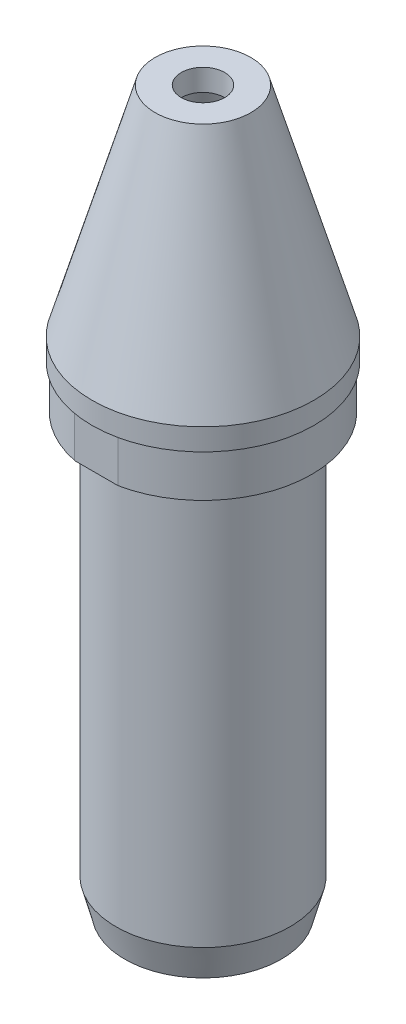
ISO-10303-21;
HEADER;
FILE_DESCRIPTION(('STEP AP214'),'2;1');
FILE_NAME('part.step','',(''),(''),'','','');
FILE_SCHEMA(('AUTOMOTIVE_DESIGN { 1 0 10303 214 1 1 1 1 }'));
ENDSEC;
DATA;
#1=APPLICATION_CONTEXT('core data for automotive mechanical design processes');
#2=APPLICATION_PROTOCOL_DEFINITION('international standard','automotive_design',2000,#1);
#3=PRODUCT_CONTEXT('',#1,'mechanical');
#4=PRODUCT('Part','Part','',(#3));
#5=PRODUCT_RELATED_PRODUCT_CATEGORY('part','',(#4));
#6=PRODUCT_DEFINITION_FORMATION('','',#4);
#7=PRODUCT_DEFINITION_CONTEXT('part definition',#1,'design');
#8=PRODUCT_DEFINITION('design','',#6,#7);
#9=PRODUCT_DEFINITION_SHAPE('','',#8);
#10=(LENGTH_UNIT() NAMED_UNIT(*) SI_UNIT(.MILLI.,.METRE.));
#11=(NAMED_UNIT(*) PLANE_ANGLE_UNIT() SI_UNIT($,.RADIAN.));
#12=(NAMED_UNIT(*) SI_UNIT($,.STERADIAN.) SOLID_ANGLE_UNIT());
#13=UNCERTAINTY_MEASURE_WITH_UNIT(LENGTH_MEASURE(1.E-05),#10,'distance_accuracy_value','');
#14=(GEOMETRIC_REPRESENTATION_CONTEXT(3) GLOBAL_UNCERTAINTY_ASSIGNED_CONTEXT((#13)) GLOBAL_UNIT_ASSIGNED_CONTEXT((#10,
#11,#12)) REPRESENTATION_CONTEXT('',''));
#15=CARTESIAN_POINT('',(0.,0.,0.));
#16=DIRECTION('',(0.,0.,1.));
#17=DIRECTION('',(1.,0.,0.));
#18=AXIS2_PLACEMENT_3D('',#15,#16,#17);
#19=CARTESIAN_POINT('',(0.,0.,0.));
#20=DIRECTION('',(0.,-1.,0.));
#21=DIRECTION('',(0.,0.,-1.));
#22=AXIS2_PLACEMENT_3D('',#19,#20,#21);
#23=CYLINDRICAL_SURFACE('',#22,2.5);
#24=DIRECTION('',(0.,-1.,0.));
#25=VECTOR('',#24,1.);
#26=CARTESIAN_POINT('',(-0.497493718553309,0.,-2.45));
#27=LINE('',#26,#25);
#28=CARTESIAN_POINT('',(-0.497493718553309,10.,-2.45));
#29=VERTEX_POINT('',#28);
#30=CARTESIAN_POINT('',(-0.497493718553309,11.,-2.45));
#31=VERTEX_POINT('',#30);
#32=EDGE_CURVE('E79',#29,#31,#27,.F.);
#33=ORIENTED_EDGE('',*,*,#32,.F.);
#34=CARTESIAN_POINT('',(0.,10.,0.));
#35=DIRECTION('',(0.,-1.,0.));
#36=DIRECTION('',(0.,0.,-1.));
#37=AXIS2_PLACEMENT_3D('',#34,#35,#36);
#38=CIRCLE('',#37,2.5);
#39=CARTESIAN_POINT('',(-0.497493718553309,10.,2.45));
#40=VERTEX_POINT('',#39);
#41=EDGE_CURVE('E99',#40,#29,#38,.T.);
#42=ORIENTED_EDGE('',*,*,#41,.F.);
#43=DIRECTION('',(0.,-1.,0.));
#44=VECTOR('',#43,1.);
#45=CARTESIAN_POINT('',(-0.497493718553309,0.,2.45));
#46=LINE('',#45,#44);
#47=CARTESIAN_POINT('',(-0.497493718553309,11.,2.45));
#48=VERTEX_POINT('',#47);
#49=EDGE_CURVE('E299',#48,#40,#46,.T.);
#50=ORIENTED_EDGE('',*,*,#49,.F.);
#51=CARTESIAN_POINT('',(0.,11.,0.));
#52=DIRECTION('',(0.,-1.,0.));
#53=DIRECTION('',(0.,0.,-1.));
#54=AXIS2_PLACEMENT_3D('',#51,#52,#53);
#55=CIRCLE('',#54,2.5);
#56=EDGE_CURVE('E91',#48,#31,#55,.T.);
#57=ORIENTED_EDGE('',*,*,#56,.T.);
#58=EDGE_LOOP('',(#33,#42,#50,#57));
#59=FACE_BOUND('',#58,.T.);
#60=ADVANCED_FACE('F34',(#59),#23,.T.);
#61=CARTESIAN_POINT('',(0.,0.,0.));
#62=DIRECTION('',(0.,-1.,0.));
#63=DIRECTION('',(0.,0.,-1.));
#64=AXIS2_PLACEMENT_3D('',#61,#62,#63);
#65=CYLINDRICAL_SURFACE('',#64,1.8);
#66=CARTESIAN_POINT('',(0.,0.,0.));
#67=DIRECTION('',(0.,-1.,0.));
#68=DIRECTION('',(0.,0.,-1.));
#69=AXIS2_PLACEMENT_3D('',#66,#67,#68);
#70=CIRCLE('',#69,1.8);
#71=CARTESIAN_POINT('',(0.,0.,-1.8));
#72=VERTEX_POINT('',#71);
#73=EDGE_CURVE('E11',#72,#72,#70,.T.);
#74=ORIENTED_EDGE('',*,*,#73,.T.);
#75=EDGE_LOOP('',(#74));
#76=FACE_BOUND('',#75,.T.);
#77=CARTESIAN_POINT('',(0.,10.,0.));
#78=DIRECTION('',(0.,-1.,0.));
#79=DIRECTION('',(0.,0.,-1.));
#80=AXIS2_PLACEMENT_3D('',#77,#78,#79);
#81=CIRCLE('',#80,1.8);
#82=CARTESIAN_POINT('',(0.,10.,-1.8));
#83=VERTEX_POINT('',#82);
#84=EDGE_CURVE('E298',#83,#83,#81,.T.);
#85=ORIENTED_EDGE('',*,*,#84,.F.);
#86=EDGE_LOOP('',(#85));
#87=FACE_BOUND('',#86,.T.);
#88=ADVANCED_FACE('F36',(#76,#87),#65,.F.);
#89=CARTESIAN_POINT('',(0.,0.,0.));
#90=DIRECTION('',(0.,1.,0.));
#91=DIRECTION('',(0.,0.,1.));
#92=AXIS2_PLACEMENT_3D('',#89,#90,#91);
#93=CONICAL_SURFACE('',#92,1.8,0.261799387799146);
#94=CARTESIAN_POINT('',(0.,0.746410161513785,0.));
#95=DIRECTION('',(0.,-1.,0.));
#96=DIRECTION('',(0.,0.,-1.));
#97=AXIS2_PLACEMENT_3D('',#94,#95,#96);
#98=CIRCLE('',#97,2.);
#99=CARTESIAN_POINT('',(0.,0.746410161513785,-2.));
#100=VERTEX_POINT('',#99);
#101=EDGE_CURVE('E42',#100,#100,#98,.T.);
#102=ORIENTED_EDGE('',*,*,#101,.T.);
#103=EDGE_LOOP('',(#102));
#104=FACE_BOUND('',#103,.T.);
#105=ORIENTED_EDGE('',*,*,#73,.F.);
#106=EDGE_LOOP('',(#105));
#107=FACE_BOUND('',#106,.T.);
#108=ADVANCED_FACE('F107',(#104,#107),#93,.T.);
#109=CARTESIAN_POINT('',(0.,0.,0.));
#110=DIRECTION('',(0.,-1.,0.));
#111=DIRECTION('',(0.,0.,-1.));
#112=AXIS2_PLACEMENT_3D('',#109,#110,#111);
#113=CYLINDRICAL_SURFACE('',#112,2.);
#114=CARTESIAN_POINT('',(0.,10.,0.));
#115=DIRECTION('',(0.,-1.,0.));
#116=DIRECTION('',(0.,0.,-1.));
#117=AXIS2_PLACEMENT_3D('',#114,#115,#116);
#118=CIRCLE('',#117,2.);
#119=CARTESIAN_POINT('',(0.,10.,-2.));
#120=VERTEX_POINT('',#119);
#121=EDGE_CURVE('E102',#120,#120,#118,.T.);
#122=ORIENTED_EDGE('',*,*,#121,.T.);
#123=EDGE_LOOP('',(#122));
#124=FACE_BOUND('',#123,.T.);
#125=ORIENTED_EDGE('',*,*,#101,.F.);
#126=EDGE_LOOP('',(#125));
#127=FACE_BOUND('',#126,.T.);
#128=ADVANCED_FACE('F110',(#124,#127),#113,.T.);
#129=CARTESIAN_POINT('',(0.,10.,0.));
#130=DIRECTION('',(0.,-1.,0.));
#131=DIRECTION('',(0.,0.,-1.));
#132=AXIS2_PLACEMENT_3D('',#129,#130,#131);
#133=PLANE('',#132);
#134=DIRECTION('',(-1.,0.,0.));
#135=VECTOR('',#134,1.);
#136=CARTESIAN_POINT('',(-2.49999999999999,10.,-2.45));
#137=LINE('',#136,#135);
#138=CARTESIAN_POINT('',(0.497493718553309,10.,-2.45));
#139=VERTEX_POINT('',#138);
#140=EDGE_CURVE('E81',#139,#29,#137,.T.);
#141=ORIENTED_EDGE('',*,*,#140,.F.);
#142=CARTESIAN_POINT('',(0.497493718553309,10.,2.45));
#143=VERTEX_POINT('',#142);
#144=EDGE_CURVE('E85',#139,#143,#38,.T.);
#145=ORIENTED_EDGE('',*,*,#144,.T.);
#146=DIRECTION('',(1.,0.,0.));
#147=VECTOR('',#146,1.);
#148=CARTESIAN_POINT('',(-2.49999999999999,10.,2.45));
#149=LINE('',#148,#147);
#150=EDGE_CURVE('E297',#40,#143,#149,.T.);
#151=ORIENTED_EDGE('',*,*,#150,.F.);
#152=ORIENTED_EDGE('',*,*,#41,.T.);
#153=EDGE_LOOP('',(#141,#145,#151,#152));
#154=FACE_BOUND('',#153,.T.);
#155=ORIENTED_EDGE('',*,*,#121,.F.);
#156=EDGE_LOOP('',(#155));
#157=FACE_BOUND('',#156,.T.);
#158=ADVANCED_FACE('F112',(#154,#157),#133,.T.);
#159=DIRECTION('',(0.,-1.,0.));
#160=VECTOR('',#159,1.);
#161=CARTESIAN_POINT('',(0.497493718553309,0.,-2.45));
#162=LINE('',#161,#160);
#163=CARTESIAN_POINT('',(0.497493718553309,11.,-2.45));
#164=VERTEX_POINT('',#163);
#165=EDGE_CURVE('E76',#164,#139,#162,.T.);
#166=ORIENTED_EDGE('',*,*,#165,.F.);
#167=CARTESIAN_POINT('',(0.497493718553309,11.,2.45));
#168=VERTEX_POINT('',#167);
#169=EDGE_CURVE('E56',#164,#168,#55,.T.);
#170=ORIENTED_EDGE('',*,*,#169,.T.);
#171=DIRECTION('',(0.,-1.,0.));
#172=VECTOR('',#171,1.);
#173=CARTESIAN_POINT('',(0.497493718553309,0.,2.45));
#174=LINE('',#173,#172);
#175=EDGE_CURVE('E294',#143,#168,#174,.F.);
#176=ORIENTED_EDGE('',*,*,#175,.F.);
#177=ORIENTED_EDGE('',*,*,#144,.F.);
#178=EDGE_LOOP('',(#166,#170,#176,#177));
#179=FACE_BOUND('',#178,.T.);
#180=ADVANCED_FACE('F84',(#179),#23,.T.);
#181=CARTESIAN_POINT('',(0.,11.,0.));
#182=DIRECTION('',(0.,-1.,0.));
#183=DIRECTION('',(0.,0.,-1.));
#184=AXIS2_PLACEMENT_3D('',#181,#182,#183);
#185=PLANE('',#184);
#186=ORIENTED_EDGE('',*,*,#169,.F.);
#187=DIRECTION('',(-1.,0.,0.));
#188=VECTOR('',#187,1.);
#189=CARTESIAN_POINT('',(-2.49999999999999,11.,-2.45));
#190=LINE('',#189,#188);
#191=EDGE_CURVE('E49',#164,#31,#190,.T.);
#192=ORIENTED_EDGE('',*,*,#191,.T.);
#193=ORIENTED_EDGE('',*,*,#56,.F.);
#194=DIRECTION('',(1.,0.,0.));
#195=VECTOR('',#194,1.);
#196=CARTESIAN_POINT('',(-2.49999999999999,11.,2.45));
#197=LINE('',#196,#195);
#198=EDGE_CURVE('E89',#48,#168,#197,.T.);
#199=ORIENTED_EDGE('',*,*,#198,.T.);
#200=EDGE_LOOP('',(#186,#192,#193,#199));
#201=FACE_BOUND('',#200,.T.);
#202=CARTESIAN_POINT('',(0.,11.,0.));
#203=DIRECTION('',(0.,-1.,0.));
#204=DIRECTION('',(0.,0.,-1.));
#205=AXIS2_PLACEMENT_3D('',#202,#203,#204);
#206=CIRCLE('',#205,2.55);
#207=CARTESIAN_POINT('',(0.,11.,-2.55));
#208=VERTEX_POINT('',#207);
#209=EDGE_CURVE('E92',#208,#208,#206,.T.);
#210=ORIENTED_EDGE('',*,*,#209,.T.);
#211=EDGE_LOOP('',(#210));
#212=FACE_BOUND('',#211,.T.);
#213=ADVANCED_FACE('F87',(#201,#212),#185,.T.);
#214=CARTESIAN_POINT('',(0.,0.,0.));
#215=DIRECTION('',(0.,-1.,0.));
#216=DIRECTION('',(0.,0.,-1.));
#217=AXIS2_PLACEMENT_3D('',#214,#215,#216);
#218=CYLINDRICAL_SURFACE('',#217,2.55);
#219=CARTESIAN_POINT('',(0.,11.5,0.));
#220=DIRECTION('',(0.,-1.,0.));
#221=DIRECTION('',(0.,0.,-1.));
#222=AXIS2_PLACEMENT_3D('',#219,#220,#221);
#223=CIRCLE('',#222,2.55);
#224=CARTESIAN_POINT('',(0.,11.5,-2.55));
#225=VERTEX_POINT('',#224);
#226=EDGE_CURVE('E95',#225,#225,#223,.T.);
#227=ORIENTED_EDGE('',*,*,#226,.T.);
#228=EDGE_LOOP('',(#227));
#229=FACE_BOUND('',#228,.T.);
#230=ORIENTED_EDGE('',*,*,#209,.F.);
#231=EDGE_LOOP('',(#230));
#232=FACE_BOUND('',#231,.T.);
#233=ADVANCED_FACE('F133',(#229,#232),#218,.T.);
#234=CARTESIAN_POINT('',(0.,11.5,0.));
#235=DIRECTION('',(0.,-1.,0.));
#236=DIRECTION('',(0.,0.,-1.));
#237=AXIS2_PLACEMENT_3D('',#234,#235,#236);
#238=CONICAL_SURFACE('',#237,2.55,0.282257421981491);
#239=CARTESIAN_POINT('',(0.,16.5,0.));
#240=DIRECTION('',(0.,-1.,0.));
#241=DIRECTION('',(0.,0.,-1.));
#242=AXIS2_PLACEMENT_3D('',#239,#240,#241);
#243=CIRCLE('',#242,1.1);
#244=CARTESIAN_POINT('',(0.,16.5,-1.1));
#245=VERTEX_POINT('',#244);
#246=EDGE_CURVE('E327',#245,#245,#243,.T.);
#247=ORIENTED_EDGE('',*,*,#246,.T.);
#248=EDGE_LOOP('',(#247));
#249=FACE_BOUND('',#248,.T.);
#250=ORIENTED_EDGE('',*,*,#226,.F.);
#251=EDGE_LOOP('',(#250));
#252=FACE_BOUND('',#251,.T.);
#253=ADVANCED_FACE('F137',(#249,#252),#238,.T.);
#254=CARTESIAN_POINT('',(0.,16.5,0.));
#255=DIRECTION('',(0.,1.,0.));
#256=DIRECTION('',(0.,0.,1.));
#257=AXIS2_PLACEMENT_3D('',#254,#255,#256);
#258=PLANE('',#257);
#259=CARTESIAN_POINT('',(0.,16.5,0.));
#260=DIRECTION('',(0.,-1.,0.));
#261=DIRECTION('',(0.,0.,-1.));
#262=AXIS2_PLACEMENT_3D('',#259,#260,#261);
#263=CIRCLE('',#262,0.5);
#264=CARTESIAN_POINT('',(0.,16.5,-0.5));
#265=VERTEX_POINT('',#264);
#266=EDGE_CURVE('E324',#265,#265,#263,.T.);
#267=ORIENTED_EDGE('',*,*,#266,.T.);
#268=EDGE_LOOP('',(#267));
#269=FACE_BOUND('',#268,.T.);
#270=ORIENTED_EDGE('',*,*,#246,.F.);
#271=EDGE_LOOP('',(#270));
#272=FACE_BOUND('',#271,.T.);
#273=ADVANCED_FACE('F143',(#269,#272),#258,.T.);
#274=CARTESIAN_POINT('',(0.,0.,0.));
#275=DIRECTION('',(0.,-1.,0.));
#276=DIRECTION('',(0.,0.,-1.));
#277=AXIS2_PLACEMENT_3D('',#274,#275,#276);
#278=CYLINDRICAL_SURFACE('',#277,0.5);
#279=ORIENTED_EDGE('',*,*,#266,.F.);
#280=EDGE_LOOP('',(#279));
#281=FACE_BOUND('',#280,.T.);
#282=CARTESIAN_POINT('',(0.,16.,0.));
#283=DIRECTION('',(0.,-1.,0.));
#284=DIRECTION('',(0.,0.,-1.));
#285=AXIS2_PLACEMENT_3D('',#282,#283,#284);
#286=CIRCLE('',#285,0.5);
#287=CARTESIAN_POINT('',(0.,16.,-0.5));
#288=VERTEX_POINT('',#287);
#289=EDGE_CURVE('E321',#288,#288,#286,.T.);
#290=ORIENTED_EDGE('',*,*,#289,.T.);
#291=EDGE_LOOP('',(#290));
#292=FACE_BOUND('',#291,.T.);
#293=ADVANCED_FACE('F147',(#281,#292),#278,.F.);
#294=CARTESIAN_POINT('',(0.,16.,0.));
#295=DIRECTION('',(0.,1.,0.));
#296=DIRECTION('',(0.,0.,1.));
#297=AXIS2_PLACEMENT_3D('',#294,#295,#296);
#298=PLANE('',#297);
#299=ORIENTED_EDGE('',*,*,#289,.F.);
#300=EDGE_LOOP('',(#299));
#301=FACE_BOUND('',#300,.T.);
#302=CARTESIAN_POINT('',(0.,16.,0.));
#303=DIRECTION('',(0.,-1.,0.));
#304=DIRECTION('',(0.,0.,-1.));
#305=AXIS2_PLACEMENT_3D('',#302,#303,#304);
#306=CIRCLE('',#305,0.724399385324989);
#307=CARTESIAN_POINT('',(0.,16.,-0.724399385324989));
#308=VERTEX_POINT('',#307);
#309=EDGE_CURVE('E318',#308,#308,#306,.T.);
#310=ORIENTED_EDGE('',*,*,#309,.T.);
#311=EDGE_LOOP('',(#310));
#312=FACE_BOUND('',#311,.T.);
#313=ADVANCED_FACE('F151',(#301,#312),#298,.F.);
#314=CARTESIAN_POINT('',(0.,16.,0.));
#315=DIRECTION('',(0.,-1.,0.));
#316=DIRECTION('',(0.,0.,-1.));
#317=AXIS2_PLACEMENT_3D('',#314,#315,#316);
#318=CONICAL_SURFACE('',#317,0.724399385324989,0.276220566558701);
#319=CARTESIAN_POINT('',(0.,11.5,0.));
#320=DIRECTION('',(0.,-1.,0.));
#321=DIRECTION('',(0.,0.,-1.));
#322=AXIS2_PLACEMENT_3D('',#319,#320,#321);
#323=CIRCLE('',#322,2.);
#324=CARTESIAN_POINT('',(0.,11.5,-2.));
#325=VERTEX_POINT('',#324);
#326=EDGE_CURVE('E315',#325,#325,#323,.T.);
#327=ORIENTED_EDGE('',*,*,#326,.T.);
#328=EDGE_LOOP('',(#327));
#329=FACE_BOUND('',#328,.T.);
#330=ORIENTED_EDGE('',*,*,#309,.F.);
#331=EDGE_LOOP('',(#330));
#332=FACE_BOUND('',#331,.T.);
#333=ADVANCED_FACE('F155',(#329,#332),#318,.F.);
#334=CARTESIAN_POINT('',(0.,0.,0.));
#335=DIRECTION('',(0.,-1.,0.));
#336=DIRECTION('',(0.,0.,-1.));
#337=AXIS2_PLACEMENT_3D('',#334,#335,#336);
#338=CYLINDRICAL_SURFACE('',#337,2.);
#339=ORIENTED_EDGE('',*,*,#326,.F.);
#340=EDGE_LOOP('',(#339));
#341=FACE_BOUND('',#340,.T.);
#342=CARTESIAN_POINT('',(0.,10.5,0.));
#343=DIRECTION('',(0.,-1.,0.));
#344=DIRECTION('',(0.,0.,-1.));
#345=AXIS2_PLACEMENT_3D('',#342,#343,#344);
#346=CIRCLE('',#345,2.);
#347=CARTESIAN_POINT('',(0.,10.5,-2.));
#348=VERTEX_POINT('',#347);
#349=EDGE_CURVE('E312',#348,#348,#346,.T.);
#350=ORIENTED_EDGE('',*,*,#349,.T.);
#351=EDGE_LOOP('',(#350));
#352=FACE_BOUND('',#351,.T.);
#353=ADVANCED_FACE('F159',(#341,#352),#338,.F.);
#354=CARTESIAN_POINT('',(0.,10.5,0.));
#355=DIRECTION('',(0.,-1.,0.));
#356=DIRECTION('',(0.,0.,-1.));
#357=AXIS2_PLACEMENT_3D('',#354,#355,#356);
#358=PLANE('',#357);
#359=ORIENTED_EDGE('',*,*,#349,.F.);
#360=EDGE_LOOP('',(#359));
#361=FACE_BOUND('',#360,.T.);
#362=CARTESIAN_POINT('',(0.,10.5,0.));
#363=DIRECTION('',(0.,-1.,0.));
#364=DIRECTION('',(0.,0.,-1.));
#365=AXIS2_PLACEMENT_3D('',#362,#363,#364);
#366=CIRCLE('',#365,1.05);
#367=CARTESIAN_POINT('',(0.,10.5,-1.05));
#368=VERTEX_POINT('',#367);
#369=EDGE_CURVE('E309',#368,#368,#366,.T.);
#370=ORIENTED_EDGE('',*,*,#369,.T.);
#371=EDGE_LOOP('',(#370));
#372=FACE_BOUND('',#371,.T.);
#373=ADVANCED_FACE('F163',(#361,#372),#358,.F.);
#374=CARTESIAN_POINT('',(0.,0.,0.));
#375=DIRECTION('',(0.,-1.,0.));
#376=DIRECTION('',(0.,0.,-1.));
#377=AXIS2_PLACEMENT_3D('',#374,#375,#376);
#378=CYLINDRICAL_SURFACE('',#377,1.05);
#379=CARTESIAN_POINT('',(0.,10.,0.));
#380=DIRECTION('',(0.,-1.,0.));
#381=DIRECTION('',(0.,0.,-1.));
#382=AXIS2_PLACEMENT_3D('',#379,#380,#381);
#383=CIRCLE('',#382,1.05);
#384=CARTESIAN_POINT('',(0.,10.,-1.05));
#385=VERTEX_POINT('',#384);
#386=EDGE_CURVE('E302',#385,#385,#383,.T.);
#387=ORIENTED_EDGE('',*,*,#386,.T.);
#388=EDGE_LOOP('',(#387));
#389=FACE_BOUND('',#388,.T.);
#390=ORIENTED_EDGE('',*,*,#369,.F.);
#391=EDGE_LOOP('',(#390));
#392=FACE_BOUND('',#391,.T.);
#393=ADVANCED_FACE('F167',(#389,#392),#378,.F.);
#394=CARTESIAN_POINT('',(0.,10.,0.));
#395=DIRECTION('',(0.,-1.,0.));
#396=DIRECTION('',(0.,0.,-1.));
#397=AXIS2_PLACEMENT_3D('',#394,#395,#396);
#398=PLANE('',#397);
#399=ORIENTED_EDGE('',*,*,#84,.T.);
#400=EDGE_LOOP('',(#399));
#401=FACE_BOUND('',#400,.T.);
#402=ORIENTED_EDGE('',*,*,#386,.F.);
#403=EDGE_LOOP('',(#402));
#404=FACE_BOUND('',#403,.T.);
#405=ADVANCED_FACE('F171',(#401,#404),#398,.T.);
#406=CARTESIAN_POINT('',(-2.49999999999999,11.,2.45));
#407=DIRECTION('',(0.,0.,-1.));
#408=DIRECTION('',(-1.,0.,0.));
#409=AXIS2_PLACEMENT_3D('',#406,#407,#408);
#410=PLANE('',#409);
#411=ORIENTED_EDGE('',*,*,#175,.T.);
#412=ORIENTED_EDGE('',*,*,#198,.F.);
#413=ORIENTED_EDGE('',*,*,#49,.T.);
#414=ORIENTED_EDGE('',*,*,#150,.T.);
#415=EDGE_LOOP('',(#411,#412,#413,#414));
#416=FACE_BOUND('',#415,.T.);
#417=ADVANCED_FACE('F175',(#416),#410,.F.);
#418=CARTESIAN_POINT('',(-2.49999999999999,11.,-2.45));
#419=DIRECTION('',(0.,0.,1.));
#420=DIRECTION('',(1.,0.,0.));
#421=AXIS2_PLACEMENT_3D('',#418,#419,#420);
#422=PLANE('',#421);
#423=ORIENTED_EDGE('',*,*,#32,.T.);
#424=ORIENTED_EDGE('',*,*,#191,.F.);
#425=ORIENTED_EDGE('',*,*,#165,.T.);
#426=ORIENTED_EDGE('',*,*,#140,.T.);
#427=EDGE_LOOP('',(#423,#424,#425,#426));
#428=FACE_BOUND('',#427,.T.);
#429=ADVANCED_FACE('F75',(#428),#422,.F.);
#430=CLOSED_SHELL('',(#60,#88,#108,#128,#158,#180,#213,#233,#253,#273,#293,#313,#333,#353,#373,
#393,#405,#417,#429));
#431=MANIFOLD_SOLID_BREP('B2',#430);
#432=ADVANCED_BREP_SHAPE_REPRESENTATION('',(#18,#431),#14);
#433=SHAPE_DEFINITION_REPRESENTATION(#9,#432);
ENDSEC;
END-ISO-10303-21;
